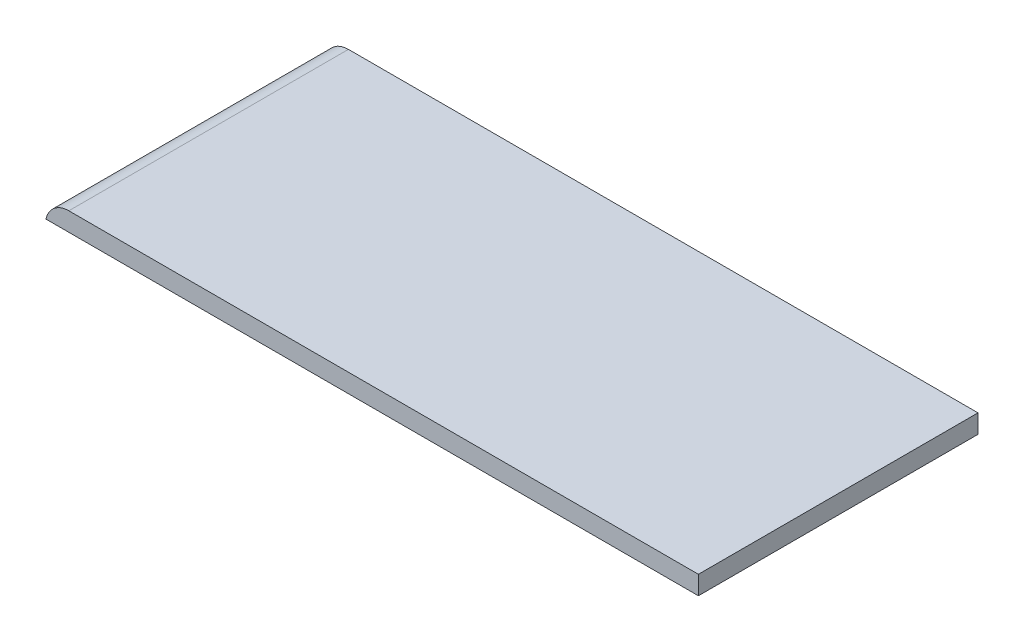
ISO-10303-21;
HEADER;
FILE_DESCRIPTION(('STEP AP214'),'2;1');
FILE_NAME('part.step','',(''),(''),'','','');
FILE_SCHEMA(('AUTOMOTIVE_DESIGN { 1 0 10303 214 1 1 1 1 }'));
ENDSEC;
DATA;
#1=APPLICATION_CONTEXT('core data for automotive mechanical design processes');
#2=APPLICATION_PROTOCOL_DEFINITION('international standard','automotive_design',2000,#1);
#3=PRODUCT_CONTEXT('',#1,'mechanical');
#4=PRODUCT('Part','Part','',(#3));
#5=PRODUCT_RELATED_PRODUCT_CATEGORY('part','',(#4));
#6=PRODUCT_DEFINITION_FORMATION('','',#4);
#7=PRODUCT_DEFINITION_CONTEXT('part definition',#1,'design');
#8=PRODUCT_DEFINITION('design','',#6,#7);
#9=PRODUCT_DEFINITION_SHAPE('','',#8);
#10=(LENGTH_UNIT() NAMED_UNIT(*) SI_UNIT(.MILLI.,.METRE.));
#11=(NAMED_UNIT(*) PLANE_ANGLE_UNIT() SI_UNIT($,.RADIAN.));
#12=(NAMED_UNIT(*) SI_UNIT($,.STERADIAN.) SOLID_ANGLE_UNIT());
#13=UNCERTAINTY_MEASURE_WITH_UNIT(LENGTH_MEASURE(1.E-05),#10,'distance_accuracy_value','');
#14=(GEOMETRIC_REPRESENTATION_CONTEXT(3) GLOBAL_UNCERTAINTY_ASSIGNED_CONTEXT((#13)) GLOBAL_UNIT_ASSIGNED_CONTEXT((#10,
#11,#12)) REPRESENTATION_CONTEXT('',''));
#15=CARTESIAN_POINT('',(0.,0.,0.));
#16=DIRECTION('',(0.,0.,1.));
#17=DIRECTION('',(1.,0.,0.));
#18=AXIS2_PLACEMENT_3D('',#15,#16,#17);
#19=CARTESIAN_POINT('',(-80.606740844463,2.,49.4977928341631));
#20=DIRECTION('',(0.,0.,-1.));
#21=DIRECTION('',(-1.,0.,0.));
#22=AXIS2_PLACEMENT_3D('',#19,#20,#21);
#23=PLANE('',#22);
#24=DIRECTION('',(1.,0.,0.));
#25=VECTOR('',#24,1.);
#26=CARTESIAN_POINT('',(-80.606740844463,2.,49.4977928341631));
#27=LINE('',#26,#25);
#28=CARTESIAN_POINT('',(-78.1572511016799,2.,49.4977928341631));
#29=VERTEX_POINT('',#28);
#30=CARTESIAN_POINT('',(-10.606740844463,2.,49.4977928341631));
#31=VERTEX_POINT('',#30);
#32=EDGE_CURVE('E74',#29,#31,#27,.T.);
#33=ORIENTED_EDGE('',*,*,#32,.F.);
#34=CARTESIAN_POINT('',(-78.1572511016799,-0.5,49.4977928341631));
#35=DIRECTION('',(0.,0.,-1.));
#36=DIRECTION('',(-1.,0.,0.));
#37=AXIS2_PLACEMENT_3D('',#34,#35,#36);
#38=CIRCLE('',#37,2.5);
#39=CARTESIAN_POINT('',(-80.606740844463,0.,49.4977928341631));
#40=VERTEX_POINT('',#39);
#41=EDGE_CURVE('E43',#29,#40,#38,.F.);
#42=ORIENTED_EDGE('',*,*,#41,.T.);
#43=DIRECTION('',(1.,0.,0.));
#44=VECTOR('',#43,1.);
#45=CARTESIAN_POINT('',(-80.606740844463,0.,49.4977928341631));
#46=LINE('',#45,#44);
#47=CARTESIAN_POINT('',(-10.606740844463,0.,49.4977928341631));
#48=VERTEX_POINT('',#47);
#49=EDGE_CURVE('E87',#40,#48,#46,.T.);
#50=ORIENTED_EDGE('',*,*,#49,.T.);
#51=DIRECTION('',(0.,-1.,0.));
#52=VECTOR('',#51,1.);
#53=CARTESIAN_POINT('',(-10.606740844463,2.,49.4977928341631));
#54=LINE('',#53,#52);
#55=EDGE_CURVE('E85',#31,#48,#54,.T.);
#56=ORIENTED_EDGE('',*,*,#55,.F.);
#57=EDGE_LOOP('',(#33,#42,#50,#56));
#58=FACE_BOUND('',#57,.T.);
#59=ADVANCED_FACE('F35',(#58),#23,.F.);
#60=CARTESIAN_POINT('',(-10.606740844463,2.,49.4977928341631));
#61=DIRECTION('',(-1.,0.,0.));
#62=DIRECTION('',(0.,0.,1.));
#63=AXIS2_PLACEMENT_3D('',#60,#61,#62);
#64=PLANE('',#63);
#65=DIRECTION('',(0.,0.,-1.));
#66=VECTOR('',#65,1.);
#67=CARTESIAN_POINT('',(-10.606740844463,0.,49.4977928341631));
#68=LINE('',#67,#66);
#69=CARTESIAN_POINT('',(-10.606740844463,0.,19.4977928341631));
#70=VERTEX_POINT('',#69);
#71=EDGE_CURVE('E101',#48,#70,#68,.T.);
#72=ORIENTED_EDGE('',*,*,#71,.T.);
#73=DIRECTION('',(0.,-1.,0.));
#74=VECTOR('',#73,1.);
#75=CARTESIAN_POINT('',(-10.606740844463,2.,19.4977928341631));
#76=LINE('',#75,#74);
#77=CARTESIAN_POINT('',(-10.606740844463,2.,19.4977928341631));
#78=VERTEX_POINT('',#77);
#79=EDGE_CURVE('E90',#78,#70,#76,.T.);
#80=ORIENTED_EDGE('',*,*,#79,.F.);
#81=DIRECTION('',(0.,0.,-1.));
#82=VECTOR('',#81,1.);
#83=CARTESIAN_POINT('',(-10.606740844463,2.,49.4977928341631));
#84=LINE('',#83,#82);
#85=EDGE_CURVE('E78',#31,#78,#84,.T.);
#86=ORIENTED_EDGE('',*,*,#85,.F.);
#87=ORIENTED_EDGE('',*,*,#55,.T.);
#88=EDGE_LOOP('',(#72,#80,#86,#87));
#89=FACE_BOUND('',#88,.T.);
#90=ADVANCED_FACE('F92',(#89),#64,.F.);
#91=CARTESIAN_POINT('',(-80.606740844463,2.,19.4977928341631));
#92=DIRECTION('',(0.,0.,1.));
#93=DIRECTION('',(1.,0.,0.));
#94=AXIS2_PLACEMENT_3D('',#91,#92,#93);
#95=PLANE('',#94);
#96=DIRECTION('',(-1.,0.,0.));
#97=VECTOR('',#96,1.);
#98=CARTESIAN_POINT('',(-80.606740844463,0.,19.4977928341631));
#99=LINE('',#98,#97);
#100=CARTESIAN_POINT('',(-80.606740844463,0.,19.4977928341631));
#101=VERTEX_POINT('',#100);
#102=EDGE_CURVE('E82',#70,#101,#99,.T.);
#103=ORIENTED_EDGE('',*,*,#102,.T.);
#104=CARTESIAN_POINT('',(-78.1572511016799,-0.5,19.4977928341631));
#105=DIRECTION('',(0.,0.,1.));
#106=DIRECTION('',(1.,0.,0.));
#107=AXIS2_PLACEMENT_3D('',#104,#105,#106);
#108=CIRCLE('',#107,2.5);
#109=CARTESIAN_POINT('',(-78.1572511016799,2.,19.4977928341631));
#110=VERTEX_POINT('',#109);
#111=EDGE_CURVE('E11',#101,#110,#108,.F.);
#112=ORIENTED_EDGE('',*,*,#111,.T.);
#113=DIRECTION('',(-1.,0.,0.));
#114=VECTOR('',#113,1.);
#115=CARTESIAN_POINT('',(-80.606740844463,2.,19.4977928341631));
#116=LINE('',#115,#114);
#117=EDGE_CURVE('E94',#78,#110,#116,.T.);
#118=ORIENTED_EDGE('',*,*,#117,.F.);
#119=ORIENTED_EDGE('',*,*,#79,.T.);
#120=EDGE_LOOP('',(#103,#112,#118,#119));
#121=FACE_BOUND('',#120,.T.);
#122=ADVANCED_FACE('F121',(#121),#95,.F.);
#123=CARTESIAN_POINT('',(0.,2.,0.));
#124=DIRECTION('',(0.,-1.,0.));
#125=DIRECTION('',(0.,0.,-1.));
#126=AXIS2_PLACEMENT_3D('',#123,#124,#125);
#127=PLANE('',#126);
#128=ORIENTED_EDGE('',*,*,#117,.T.);
#129=DIRECTION('',(0.,0.,-1.));
#130=VECTOR('',#129,1.);
#131=CARTESIAN_POINT('',(-78.1572511016799,2.,0.));
#132=LINE('',#131,#130);
#133=EDGE_CURVE('E80',#110,#29,#132,.F.);
#134=ORIENTED_EDGE('',*,*,#133,.T.);
#135=ORIENTED_EDGE('',*,*,#32,.T.);
#136=ORIENTED_EDGE('',*,*,#85,.T.);
#137=EDGE_LOOP('',(#128,#134,#135,#136));
#138=FACE_BOUND('',#137,.T.);
#139=ADVANCED_FACE('F76',(#138),#127,.F.);
#140=CARTESIAN_POINT('',(0.,0.,0.));
#141=DIRECTION('',(0.,-1.,0.));
#142=DIRECTION('',(0.,0.,-1.));
#143=AXIS2_PLACEMENT_3D('',#140,#141,#142);
#144=PLANE('',#143);
#145=DIRECTION('',(0.,0.,1.));
#146=VECTOR('',#145,1.);
#147=CARTESIAN_POINT('',(-80.606740844463,0.,49.4977928341631));
#148=LINE('',#147,#146);
#149=EDGE_CURVE('E98',#101,#40,#148,.T.);
#150=ORIENTED_EDGE('',*,*,#149,.F.);
#151=ORIENTED_EDGE('',*,*,#102,.F.);
#152=ORIENTED_EDGE('',*,*,#71,.F.);
#153=ORIENTED_EDGE('',*,*,#49,.F.);
#154=EDGE_LOOP('',(#150,#151,#152,#153));
#155=FACE_BOUND('',#154,.T.);
#156=ADVANCED_FACE('F107',(#155),#144,.T.);
#157=CARTESIAN_POINT('',(-78.1572511016799,-0.5,49.4977928341631));
#158=DIRECTION('',(0.,0.,-1.));
#159=DIRECTION('',(-1.,0.,0.));
#160=AXIS2_PLACEMENT_3D('',#157,#158,#159);
#161=CYLINDRICAL_SURFACE('',#160,2.5);
#162=ORIENTED_EDGE('',*,*,#111,.F.);
#163=ORIENTED_EDGE('',*,*,#149,.T.);
#164=ORIENTED_EDGE('',*,*,#41,.F.);
#165=ORIENTED_EDGE('',*,*,#133,.F.);
#166=EDGE_LOOP('',(#162,#163,#164,#165));
#167=FACE_BOUND('',#166,.T.);
#168=ADVANCED_FACE('F37',(#167),#161,.T.);
#169=CLOSED_SHELL('',(#59,#90,#122,#139,#156,#168));
#170=MANIFOLD_SOLID_BREP('B2',#169);
#171=ADVANCED_BREP_SHAPE_REPRESENTATION('',(#18,#170),#14);
#172=SHAPE_DEFINITION_REPRESENTATION(#9,#171);
ENDSEC;
END-ISO-10303-21;
